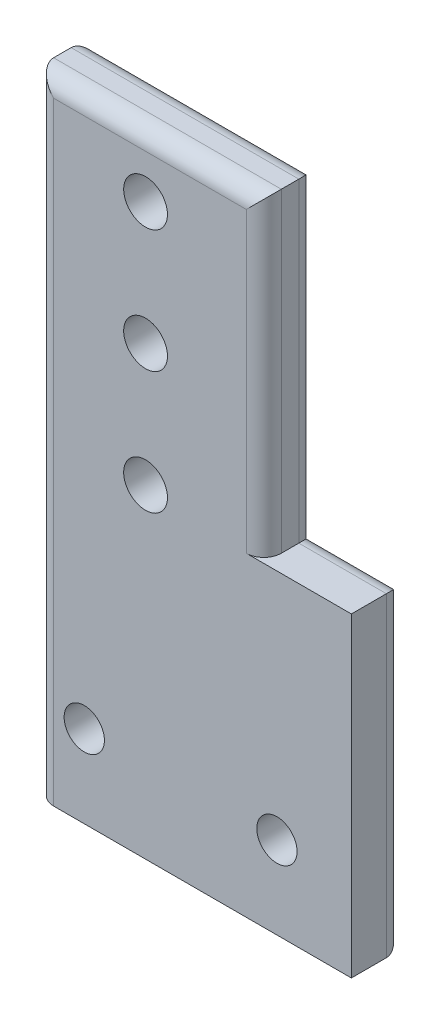
ISO-10303-21;
HEADER;
FILE_DESCRIPTION(('STEP AP214'),'2;1');
FILE_NAME('part.step','',(''),(''),'','','');
FILE_SCHEMA(('AUTOMOTIVE_DESIGN { 1 0 10303 214 1 1 1 1 }'));
ENDSEC;
DATA;
#1=APPLICATION_CONTEXT('core data for automotive mechanical design processes');
#2=APPLICATION_PROTOCOL_DEFINITION('international standard','automotive_design',2000,#1);
#3=PRODUCT_CONTEXT('',#1,'mechanical');
#4=PRODUCT('Part','Part','',(#3));
#5=PRODUCT_RELATED_PRODUCT_CATEGORY('part','',(#4));
#6=PRODUCT_DEFINITION_FORMATION('','',#4);
#7=PRODUCT_DEFINITION_CONTEXT('part definition',#1,'design');
#8=PRODUCT_DEFINITION('design','',#6,#7);
#9=PRODUCT_DEFINITION_SHAPE('','',#8);
#10=(LENGTH_UNIT() NAMED_UNIT(*) SI_UNIT(.MILLI.,.METRE.));
#11=(NAMED_UNIT(*) PLANE_ANGLE_UNIT() SI_UNIT($,.RADIAN.));
#12=(NAMED_UNIT(*) SI_UNIT($,.STERADIAN.) SOLID_ANGLE_UNIT());
#13=UNCERTAINTY_MEASURE_WITH_UNIT(LENGTH_MEASURE(1.E-05),#10,'distance_accuracy_value','');
#14=(GEOMETRIC_REPRESENTATION_CONTEXT(3) GLOBAL_UNCERTAINTY_ASSIGNED_CONTEXT((#13)) GLOBAL_UNIT_ASSIGNED_CONTEXT((#10,
#11,#12)) REPRESENTATION_CONTEXT('',''));
#15=CARTESIAN_POINT('',(0.,0.,0.));
#16=DIRECTION('',(0.,0.,1.));
#17=DIRECTION('',(1.,0.,0.));
#18=AXIS2_PLACEMENT_3D('',#15,#16,#17);
#19=CARTESIAN_POINT('',(0.,0.,3.));
#20=DIRECTION('',(0.,0.,-1.));
#21=DIRECTION('',(-1.,0.,0.));
#22=AXIS2_PLACEMENT_3D('',#19,#20,#21);
#23=PLANE('',#22);
#24=DIRECTION('',(-1.,0.,0.));
#25=VECTOR('',#24,1.);
#26=CARTESIAN_POINT('',(-14.25,3.00000000000001,3.));
#27=LINE('',#26,#25);
#28=CARTESIAN_POINT('',(-9.24999999999998,3.00000000000001,3.));
#29=VERTEX_POINT('',#28);
#30=CARTESIAN_POINT('',(-15.25,3.00000000000001,3.));
#31=VERTEX_POINT('',#30);
#32=EDGE_CURVE('E63',#29,#31,#27,.T.);
#33=ORIENTED_EDGE('',*,*,#32,.T.);
#34=DIRECTION('',(0.,1.,0.));
#35=VECTOR('',#34,1.);
#36=CARTESIAN_POINT('',(-15.25,0.,3.));
#37=LINE('',#36,#35);
#38=CARTESIAN_POINT('',(-15.25,20.,3.));
#39=VERTEX_POINT('',#38);
#40=EDGE_CURVE('E55',#31,#39,#37,.T.);
#41=ORIENTED_EDGE('',*,*,#40,.T.);
#42=DIRECTION('',(-1.,0.,0.));
#43=VECTOR('',#42,1.);
#44=CARTESIAN_POINT('',(0.,20.,3.));
#45=LINE('',#44,#43);
#46=CARTESIAN_POINT('',(-26.25,20.,3.));
#47=VERTEX_POINT('',#46);
#48=EDGE_CURVE('E226',#39,#47,#45,.T.);
#49=ORIENTED_EDGE('',*,*,#48,.T.);
#50=DIRECTION('',(0.,-1.,0.));
#51=VECTOR('',#50,1.);
#52=CARTESIAN_POINT('',(-26.25,0.,3.));
#53=LINE('',#52,#51);
#54=CARTESIAN_POINT('',(-26.25,-15.,3.));
#55=VERTEX_POINT('',#54);
#56=EDGE_CURVE('E134',#47,#55,#53,.T.);
#57=ORIENTED_EDGE('',*,*,#56,.T.);
#58=DIRECTION('',(1.,0.,0.));
#59=VECTOR('',#58,1.);
#60=CARTESIAN_POINT('',(-9.24999999999998,-15.,3.));
#61=LINE('',#60,#59);
#62=CARTESIAN_POINT('',(-9.24999999999998,-15.,3.));
#63=VERTEX_POINT('',#62);
#64=EDGE_CURVE('E127',#55,#63,#61,.T.);
#65=ORIENTED_EDGE('',*,*,#64,.T.);
#66=DIRECTION('',(0.,1.,0.));
#67=VECTOR('',#66,1.);
#68=CARTESIAN_POINT('',(-9.24999999999998,3.00000000000001,3.));
#69=LINE('',#68,#67);
#70=EDGE_CURVE('E131',#63,#29,#69,.T.);
#71=ORIENTED_EDGE('',*,*,#70,.T.);
#72=EDGE_LOOP('',(#33,#41,#49,#57,#65,#71));
#73=FACE_BOUND('',#72,.T.);
#74=CARTESIAN_POINT('',(-21.,17.5,3.));
#75=DIRECTION('',(0.,0.,1.));
#76=DIRECTION('',(1.,0.,0.));
#77=AXIS2_PLACEMENT_3D('',#74,#75,#76);
#78=CIRCLE('',#77,1.25);
#79=CARTESIAN_POINT('',(-19.75,17.5,3.));
#80=VERTEX_POINT('',#79);
#81=EDGE_CURVE('E138',#80,#80,#78,.T.);
#82=ORIENTED_EDGE('',*,*,#81,.F.);
#83=EDGE_LOOP('',(#82));
#84=FACE_BOUND('',#83,.T.);
#85=CARTESIAN_POINT('',(-21.,10.5,3.));
#86=DIRECTION('',(0.,0.,1.));
#87=DIRECTION('',(1.,0.,0.));
#88=AXIS2_PLACEMENT_3D('',#85,#86,#87);
#89=CIRCLE('',#88,1.25);
#90=CARTESIAN_POINT('',(-19.75,10.5,3.));
#91=VERTEX_POINT('',#90);
#92=EDGE_CURVE('E379',#91,#91,#89,.T.);
#93=ORIENTED_EDGE('',*,*,#92,.F.);
#94=EDGE_LOOP('',(#93));
#95=FACE_BOUND('',#94,.T.);
#96=CARTESIAN_POINT('',(-21.,3.5,3.));
#97=DIRECTION('',(0.,0.,1.));
#98=DIRECTION('',(1.,0.,0.));
#99=AXIS2_PLACEMENT_3D('',#96,#97,#98);
#100=CIRCLE('',#99,1.25);
#101=CARTESIAN_POINT('',(-19.75,3.5,3.));
#102=VERTEX_POINT('',#101);
#103=EDGE_CURVE('E385',#102,#102,#100,.T.);
#104=ORIENTED_EDGE('',*,*,#103,.F.);
#105=EDGE_LOOP('',(#104));
#106=FACE_BOUND('',#105,.T.);
#107=CARTESIAN_POINT('',(-13.5,-10.3000000000001,3.));
#108=DIRECTION('',(0.,0.,1.));
#109=DIRECTION('',(1.,0.,0.));
#110=AXIS2_PLACEMENT_3D('',#107,#108,#109);
#111=CIRCLE('',#110,1.15);
#112=CARTESIAN_POINT('',(-12.35,-10.3000000000001,3.));
#113=VERTEX_POINT('',#112);
#114=EDGE_CURVE('E416',#113,#113,#111,.T.);
#115=ORIENTED_EDGE('',*,*,#114,.F.);
#116=EDGE_LOOP('',(#115));
#117=FACE_BOUND('',#116,.T.);
#118=CARTESIAN_POINT('',(-24.5,-10.3000000000001,3.));
#119=DIRECTION('',(0.,0.,1.));
#120=DIRECTION('',(1.,0.,0.));
#121=AXIS2_PLACEMENT_3D('',#118,#119,#120);
#122=CIRCLE('',#121,1.15);
#123=CARTESIAN_POINT('',(-23.35,-10.3000000000001,3.));
#124=VERTEX_POINT('',#123);
#125=EDGE_CURVE('E410',#124,#124,#122,.T.);
#126=ORIENTED_EDGE('',*,*,#125,.F.);
#127=EDGE_LOOP('',(#126));
#128=FACE_BOUND('',#127,.T.);
#129=ADVANCED_FACE('F45',(#73,#84,#95,#106,#117,#128),#23,.F.);
#130=CARTESIAN_POINT('',(0.,0.,0.));
#131=DIRECTION('',(0.,0.,-1.));
#132=DIRECTION('',(-1.,0.,0.));
#133=AXIS2_PLACEMENT_3D('',#130,#131,#132);
#134=PLANE('',#133);
#135=DIRECTION('',(0.,1.,0.));
#136=VECTOR('',#135,1.);
#137=CARTESIAN_POINT('',(-10.25,-15.,0.));
#138=LINE('',#137,#136);
#139=CARTESIAN_POINT('',(-10.25,2.00000000000001,0.));
#140=VERTEX_POINT('',#139);
#141=CARTESIAN_POINT('',(-10.25,-14.,0.));
#142=VERTEX_POINT('',#141);
#143=EDGE_CURVE('E193',#140,#142,#138,.F.);
#144=ORIENTED_EDGE('',*,*,#143,.T.);
#145=DIRECTION('',(1.,0.,0.));
#146=VECTOR('',#145,1.);
#147=CARTESIAN_POINT('',(-27.25,-14.,0.));
#148=LINE('',#147,#146);
#149=CARTESIAN_POINT('',(-26.25,-14.,0.));
#150=VERTEX_POINT('',#149);
#151=EDGE_CURVE('E196',#142,#150,#148,.F.);
#152=ORIENTED_EDGE('',*,*,#151,.T.);
#153=DIRECTION('',(0.,-1.,0.));
#154=VECTOR('',#153,1.);
#155=CARTESIAN_POINT('',(-26.25,21.,0.));
#156=LINE('',#155,#154);
#157=CARTESIAN_POINT('',(-26.25,20.,0.));
#158=VERTEX_POINT('',#157);
#159=EDGE_CURVE('E181',#150,#158,#156,.F.);
#160=ORIENTED_EDGE('',*,*,#159,.T.);
#161=DIRECTION('',(-1.,0.,0.));
#162=VECTOR('',#161,1.);
#163=CARTESIAN_POINT('',(-14.25,20.,0.));
#164=LINE('',#163,#162);
#165=CARTESIAN_POINT('',(-15.25,20.,0.));
#166=VERTEX_POINT('',#165);
#167=EDGE_CURVE('E184',#158,#166,#164,.F.);
#168=ORIENTED_EDGE('',*,*,#167,.T.);
#169=DIRECTION('',(0.,1.,0.));
#170=VECTOR('',#169,1.);
#171=CARTESIAN_POINT('',(-15.25,3.00000000000001,0.));
#172=LINE('',#171,#170);
#173=CARTESIAN_POINT('',(-15.25,2.00000000000001,0.));
#174=VERTEX_POINT('',#173);
#175=EDGE_CURVE('E187',#166,#174,#172,.F.);
#176=ORIENTED_EDGE('',*,*,#175,.T.);
#177=DIRECTION('',(-1.,0.,0.));
#178=VECTOR('',#177,1.);
#179=CARTESIAN_POINT('',(-9.24999999999998,2.00000000000001,0.));
#180=LINE('',#179,#178);
#181=EDGE_CURVE('E190',#174,#140,#180,.F.);
#182=ORIENTED_EDGE('',*,*,#181,.T.);
#183=EDGE_LOOP('',(#144,#152,#160,#168,#176,#182));
#184=FACE_BOUND('',#183,.T.);
#185=CARTESIAN_POINT('',(-13.5,-10.3000000000001,0.));
#186=DIRECTION('',(0.,0.,1.));
#187=DIRECTION('',(1.,0.,0.));
#188=AXIS2_PLACEMENT_3D('',#185,#186,#187);
#189=CIRCLE('',#188,1.15);
#190=CARTESIAN_POINT('',(-12.35,-10.3000000000001,0.));
#191=VERTEX_POINT('',#190);
#192=EDGE_CURVE('E413',#191,#191,#189,.T.);
#193=ORIENTED_EDGE('',*,*,#192,.T.);
#194=EDGE_LOOP('',(#193));
#195=FACE_BOUND('',#194,.T.);
#196=CARTESIAN_POINT('',(-21.,10.5,0.));
#197=DIRECTION('',(0.,0.,1.));
#198=DIRECTION('',(1.,0.,0.));
#199=AXIS2_PLACEMENT_3D('',#196,#197,#198);
#200=CIRCLE('',#199,1.25);
#201=CARTESIAN_POINT('',(-19.75,10.5,0.));
#202=VERTEX_POINT('',#201);
#203=EDGE_CURVE('E382',#202,#202,#200,.T.);
#204=ORIENTED_EDGE('',*,*,#203,.T.);
#205=EDGE_LOOP('',(#204));
#206=FACE_BOUND('',#205,.T.);
#207=CARTESIAN_POINT('',(-21.,17.5,0.));
#208=DIRECTION('',(0.,0.,1.));
#209=DIRECTION('',(1.,0.,0.));
#210=AXIS2_PLACEMENT_3D('',#207,#208,#209);
#211=CIRCLE('',#210,1.25);
#212=CARTESIAN_POINT('',(-19.75,17.5,0.));
#213=VERTEX_POINT('',#212);
#214=EDGE_CURVE('E389',#213,#213,#211,.T.);
#215=ORIENTED_EDGE('',*,*,#214,.T.);
#216=EDGE_LOOP('',(#215));
#217=FACE_BOUND('',#216,.T.);
#218=CARTESIAN_POINT('',(-21.,3.5,0.));
#219=DIRECTION('',(0.,0.,1.));
#220=DIRECTION('',(1.,0.,0.));
#221=AXIS2_PLACEMENT_3D('',#218,#219,#220);
#222=CIRCLE('',#221,1.25);
#223=CARTESIAN_POINT('',(-19.75,3.5,0.));
#224=VERTEX_POINT('',#223);
#225=EDGE_CURVE('E392',#224,#224,#222,.T.);
#226=ORIENTED_EDGE('',*,*,#225,.T.);
#227=EDGE_LOOP('',(#226));
#228=FACE_BOUND('',#227,.T.);
#229=CARTESIAN_POINT('',(-24.5,-10.3000000000001,0.));
#230=DIRECTION('',(0.,0.,1.));
#231=DIRECTION('',(1.,0.,0.));
#232=AXIS2_PLACEMENT_3D('',#229,#230,#231);
#233=CIRCLE('',#232,1.15);
#234=CARTESIAN_POINT('',(-23.35,-10.3000000000001,0.));
#235=VERTEX_POINT('',#234);
#236=EDGE_CURVE('E252',#235,#235,#233,.T.);
#237=ORIENTED_EDGE('',*,*,#236,.T.);
#238=EDGE_LOOP('',(#237));
#239=FACE_BOUND('',#238,.T.);
#240=ADVANCED_FACE('F285',(#184,#195,#206,#217,#228,#239),#134,.T.);
#241=CARTESIAN_POINT('',(-27.25,21.,3.));
#242=DIRECTION('',(0.,-1.,0.));
#243=DIRECTION('',(0.,0.,-1.));
#244=AXIS2_PLACEMENT_3D('',#241,#242,#243);
#245=PLANE('',#244);
#246=DIRECTION('',(0.,0.,-1.));
#247=VECTOR('',#246,1.);
#248=CARTESIAN_POINT('',(-14.25,21.,3.));
#249=LINE('',#248,#247);
#250=CARTESIAN_POINT('',(-14.25,21.,2.));
#251=VERTEX_POINT('',#250);
#252=CARTESIAN_POINT('',(-14.25,21.,1.));
#253=VERTEX_POINT('',#252);
#254=EDGE_CURVE('E157',#251,#253,#249,.T.);
#255=ORIENTED_EDGE('',*,*,#254,.T.);
#256=DIRECTION('',(-1.,0.,0.));
#257=VECTOR('',#256,1.);
#258=CARTESIAN_POINT('',(-27.25,21.,1.));
#259=LINE('',#258,#257);
#260=CARTESIAN_POINT('',(-27.25,21.,1.));
#261=VERTEX_POINT('',#260);
#262=EDGE_CURVE('E215',#253,#261,#259,.T.);
#263=ORIENTED_EDGE('',*,*,#262,.T.);
#264=DIRECTION('',(0.,0.,-1.));
#265=VECTOR('',#264,1.);
#266=CARTESIAN_POINT('',(-27.25,21.,3.));
#267=LINE('',#266,#265);
#268=CARTESIAN_POINT('',(-27.25,21.,2.));
#269=VERTEX_POINT('',#268);
#270=EDGE_CURVE('E172',#269,#261,#267,.T.);
#271=ORIENTED_EDGE('',*,*,#270,.F.);
#272=DIRECTION('',(-1.,0.,0.));
#273=VECTOR('',#272,1.);
#274=CARTESIAN_POINT('',(-27.25,21.,2.));
#275=LINE('',#274,#273);
#276=EDGE_CURVE('E212',#269,#251,#275,.F.);
#277=ORIENTED_EDGE('',*,*,#276,.T.);
#278=EDGE_LOOP('',(#255,#263,#271,#277));
#279=FACE_BOUND('',#278,.T.);
#280=ADVANCED_FACE('F304',(#279),#245,.F.);
#281=CARTESIAN_POINT('',(-27.25,-15.,3.));
#282=DIRECTION('',(1.,0.,0.));
#283=DIRECTION('',(0.,1.,0.));
#284=AXIS2_PLACEMENT_3D('',#281,#282,#283);
#285=PLANE('',#284);
#286=ORIENTED_EDGE('',*,*,#270,.T.);
#287=DIRECTION('',(0.,-1.,0.));
#288=VECTOR('',#287,1.);
#289=CARTESIAN_POINT('',(-27.25,-15.,1.));
#290=LINE('',#289,#288);
#291=CARTESIAN_POINT('',(-27.25,-15.,1.));
#292=VERTEX_POINT('',#291);
#293=EDGE_CURVE('E221',#261,#292,#290,.T.);
#294=ORIENTED_EDGE('',*,*,#293,.T.);
#295=DIRECTION('',(0.,0.,-1.));
#296=VECTOR('',#295,1.);
#297=CARTESIAN_POINT('',(-27.25,-15.,3.));
#298=LINE('',#297,#296);
#299=CARTESIAN_POINT('',(-27.25,-15.,2.));
#300=VERTEX_POINT('',#299);
#301=EDGE_CURVE('E149',#300,#292,#298,.T.);
#302=ORIENTED_EDGE('',*,*,#301,.F.);
#303=DIRECTION('',(0.,-1.,0.));
#304=VECTOR('',#303,1.);
#305=CARTESIAN_POINT('',(-27.25,-15.,2.));
#306=LINE('',#305,#304);
#307=EDGE_CURVE('E218',#300,#269,#306,.F.);
#308=ORIENTED_EDGE('',*,*,#307,.T.);
#309=EDGE_LOOP('',(#286,#294,#302,#308));
#310=FACE_BOUND('',#309,.T.);
#311=ADVANCED_FACE('F307',(#310),#285,.F.);
#312=CARTESIAN_POINT('',(-9.24999999999998,-15.,3.));
#313=DIRECTION('',(0.,1.,0.));
#314=DIRECTION('',(-1.,0.,0.));
#315=AXIS2_PLACEMENT_3D('',#312,#313,#314);
#316=PLANE('',#315);
#317=ORIENTED_EDGE('',*,*,#301,.T.);
#318=DIRECTION('',(1.,0.,0.));
#319=VECTOR('',#318,1.);
#320=CARTESIAN_POINT('',(-9.24999999999998,-15.,1.));
#321=LINE('',#320,#319);
#322=CARTESIAN_POINT('',(-9.24999999999998,-15.,1.));
#323=VERTEX_POINT('',#322);
#324=EDGE_CURVE('E146',#292,#323,#321,.T.);
#325=ORIENTED_EDGE('',*,*,#324,.T.);
#326=DIRECTION('',(0.,0.,-1.));
#327=VECTOR('',#326,1.);
#328=CARTESIAN_POINT('',(-9.24999999999998,-15.,3.));
#329=LINE('',#328,#327);
#330=EDGE_CURVE('E142',#63,#323,#329,.T.);
#331=ORIENTED_EDGE('',*,*,#330,.F.);
#332=ORIENTED_EDGE('',*,*,#64,.F.);
#333=CARTESIAN_POINT('',(-26.25,-15.,2.));
#334=DIRECTION('',(0.,1.,0.));
#335=DIRECTION('',(-1.,0.,0.));
#336=AXIS2_PLACEMENT_3D('',#333,#334,#335);
#337=CIRCLE('',#336,1.);
#338=EDGE_CURVE('E176',#55,#300,#337,.F.);
#339=ORIENTED_EDGE('',*,*,#338,.T.);
#340=EDGE_LOOP('',(#317,#325,#331,#332,#339));
#341=FACE_BOUND('',#340,.T.);
#342=ADVANCED_FACE('F144',(#341),#316,.F.);
#343=CARTESIAN_POINT('',(-9.24999999999998,3.00000000000001,3.));
#344=DIRECTION('',(-1.,0.,0.));
#345=DIRECTION('',(0.,-1.,0.));
#346=AXIS2_PLACEMENT_3D('',#343,#344,#345);
#347=PLANE('',#346);
#348=ORIENTED_EDGE('',*,*,#330,.T.);
#349=DIRECTION('',(0.,1.,0.));
#350=VECTOR('',#349,1.);
#351=CARTESIAN_POINT('',(-9.24999999999998,3.00000000000001,1.));
#352=LINE('',#351,#350);
#353=CARTESIAN_POINT('',(-9.24999999999998,3.00000000000001,1.));
#354=VERTEX_POINT('',#353);
#355=EDGE_CURVE('E200',#323,#354,#352,.T.);
#356=ORIENTED_EDGE('',*,*,#355,.T.);
#357=DIRECTION('',(0.,0.,-1.));
#358=VECTOR('',#357,1.);
#359=CARTESIAN_POINT('',(-9.24999999999998,3.00000000000001,3.));
#360=LINE('',#359,#358);
#361=EDGE_CURVE('E150',#29,#354,#360,.T.);
#362=ORIENTED_EDGE('',*,*,#361,.F.);
#363=ORIENTED_EDGE('',*,*,#70,.F.);
#364=EDGE_LOOP('',(#348,#356,#362,#363));
#365=FACE_BOUND('',#364,.T.);
#366=ADVANCED_FACE('F152',(#365),#347,.F.);
#367=CARTESIAN_POINT('',(-14.25,3.00000000000001,3.));
#368=DIRECTION('',(0.,-1.,0.));
#369=DIRECTION('',(0.,0.,-1.));
#370=AXIS2_PLACEMENT_3D('',#367,#368,#369);
#371=PLANE('',#370);
#372=ORIENTED_EDGE('',*,*,#361,.T.);
#373=DIRECTION('',(-1.,0.,0.));
#374=VECTOR('',#373,1.);
#375=CARTESIAN_POINT('',(-14.25,3.00000000000001,1.));
#376=LINE('',#375,#374);
#377=CARTESIAN_POINT('',(-14.25,3.00000000000001,1.));
#378=VERTEX_POINT('',#377);
#379=EDGE_CURVE('E203',#354,#378,#376,.T.);
#380=ORIENTED_EDGE('',*,*,#379,.T.);
#381=DIRECTION('',(0.,0.,-1.));
#382=VECTOR('',#381,1.);
#383=CARTESIAN_POINT('',(-14.25,3.00000000000001,3.));
#384=LINE('',#383,#382);
#385=CARTESIAN_POINT('',(-14.25,3.00000000000001,2.));
#386=VERTEX_POINT('',#385);
#387=EDGE_CURVE('E164',#386,#378,#384,.T.);
#388=ORIENTED_EDGE('',*,*,#387,.F.);
#389=CARTESIAN_POINT('',(-15.25,3.00000000000001,2.));
#390=DIRECTION('',(0.,-1.,0.));
#391=DIRECTION('',(0.,0.,-1.));
#392=AXIS2_PLACEMENT_3D('',#389,#390,#391);
#393=CIRCLE('',#392,1.);
#394=EDGE_CURVE('E11',#386,#31,#393,.T.);
#395=ORIENTED_EDGE('',*,*,#394,.T.);
#396=ORIENTED_EDGE('',*,*,#32,.F.);
#397=EDGE_LOOP('',(#372,#380,#388,#395,#396));
#398=FACE_BOUND('',#397,.T.);
#399=ADVANCED_FACE('F271',(#398),#371,.F.);
#400=CARTESIAN_POINT('',(-14.25,21.,3.));
#401=DIRECTION('',(-1.,0.,0.));
#402=DIRECTION('',(0.,-1.,0.));
#403=AXIS2_PLACEMENT_3D('',#400,#401,#402);
#404=PLANE('',#403);
#405=ORIENTED_EDGE('',*,*,#387,.T.);
#406=DIRECTION('',(0.,1.,0.));
#407=VECTOR('',#406,1.);
#408=CARTESIAN_POINT('',(-14.25,21.,1.));
#409=LINE('',#408,#407);
#410=EDGE_CURVE('E209',#378,#253,#409,.T.);
#411=ORIENTED_EDGE('',*,*,#410,.T.);
#412=ORIENTED_EDGE('',*,*,#254,.F.);
#413=DIRECTION('',(0.,1.,0.));
#414=VECTOR('',#413,1.);
#415=CARTESIAN_POINT('',(-14.25,21.,2.));
#416=LINE('',#415,#414);
#417=EDGE_CURVE('E206',#251,#386,#416,.F.);
#418=ORIENTED_EDGE('',*,*,#417,.T.);
#419=EDGE_LOOP('',(#405,#411,#412,#418));
#420=FACE_BOUND('',#419,.T.);
#421=ADVANCED_FACE('F268',(#420),#404,.F.);
#422=CARTESIAN_POINT('',(-21.,17.5,3.));
#423=DIRECTION('',(0.,0.,-1.));
#424=DIRECTION('',(-1.,0.,0.));
#425=AXIS2_PLACEMENT_3D('',#422,#423,#424);
#426=CYLINDRICAL_SURFACE('',#425,1.25);
#427=ORIENTED_EDGE('',*,*,#81,.T.);
#428=EDGE_LOOP('',(#427));
#429=FACE_BOUND('',#428,.T.);
#430=ORIENTED_EDGE('',*,*,#214,.F.);
#431=EDGE_LOOP('',(#430));
#432=FACE_BOUND('',#431,.T.);
#433=ADVANCED_FACE('F326',(#429,#432),#426,.F.);
#434=CARTESIAN_POINT('',(-21.,10.5,3.));
#435=DIRECTION('',(0.,0.,-1.));
#436=DIRECTION('',(-1.,0.,0.));
#437=AXIS2_PLACEMENT_3D('',#434,#435,#436);
#438=CYLINDRICAL_SURFACE('',#437,1.25);
#439=ORIENTED_EDGE('',*,*,#92,.T.);
#440=EDGE_LOOP('',(#439));
#441=FACE_BOUND('',#440,.T.);
#442=ORIENTED_EDGE('',*,*,#203,.F.);
#443=EDGE_LOOP('',(#442));
#444=FACE_BOUND('',#443,.T.);
#445=ADVANCED_FACE('F368',(#441,#444),#438,.F.);
#446=CARTESIAN_POINT('',(-21.,3.5,3.));
#447=DIRECTION('',(0.,0.,-1.));
#448=DIRECTION('',(-1.,0.,0.));
#449=AXIS2_PLACEMENT_3D('',#446,#447,#448);
#450=CYLINDRICAL_SURFACE('',#449,1.25);
#451=ORIENTED_EDGE('',*,*,#103,.T.);
#452=EDGE_LOOP('',(#451));
#453=FACE_BOUND('',#452,.T.);
#454=ORIENTED_EDGE('',*,*,#225,.F.);
#455=EDGE_LOOP('',(#454));
#456=FACE_BOUND('',#455,.T.);
#457=ADVANCED_FACE('F361',(#453,#456),#450,.F.);
#458=CARTESIAN_POINT('',(-13.5,-10.3000000000001,3.));
#459=DIRECTION('',(0.,0.,-1.));
#460=DIRECTION('',(-1.,0.,0.));
#461=AXIS2_PLACEMENT_3D('',#458,#459,#460);
#462=CYLINDRICAL_SURFACE('',#461,1.15);
#463=ORIENTED_EDGE('',*,*,#114,.T.);
#464=EDGE_LOOP('',(#463));
#465=FACE_BOUND('',#464,.T.);
#466=ORIENTED_EDGE('',*,*,#192,.F.);
#467=EDGE_LOOP('',(#466));
#468=FACE_BOUND('',#467,.T.);
#469=ADVANCED_FACE('F355',(#465,#468),#462,.F.);
#470=CARTESIAN_POINT('',(-24.5,-10.3000000000001,3.));
#471=DIRECTION('',(0.,0.,-1.));
#472=DIRECTION('',(-1.,0.,0.));
#473=AXIS2_PLACEMENT_3D('',#470,#471,#472);
#474=CYLINDRICAL_SURFACE('',#473,1.15);
#475=ORIENTED_EDGE('',*,*,#125,.T.);
#476=EDGE_LOOP('',(#475));
#477=FACE_BOUND('',#476,.T.);
#478=ORIENTED_EDGE('',*,*,#236,.F.);
#479=EDGE_LOOP('',(#478));
#480=FACE_BOUND('',#479,.T.);
#481=ADVANCED_FACE('F352',(#477,#480),#474,.F.);
#482=CARTESIAN_POINT('',(-15.25,21.,1.));
#483=DIRECTION('',(0.,-1.,0.));
#484=DIRECTION('',(1.,0.,0.));
#485=AXIS2_PLACEMENT_3D('',#482,#483,#484);
#486=CYLINDRICAL_SURFACE('',#485,1.);
#487=CARTESIAN_POINT('',(-15.25,2.00000000000001,1.));
#488=DIRECTION('',(0.707106781186547,-0.707106781186548,0.));
#489=DIRECTION('',(0.707106781186548,0.707106781186547,0.));
#490=AXIS2_PLACEMENT_3D('',#487,#488,#489);
#491=ELLIPSE('',#490,1.4142135623731,1.);
#492=EDGE_CURVE('E245',#174,#378,#491,.T.);
#493=ORIENTED_EDGE('',*,*,#492,.F.);
#494=ORIENTED_EDGE('',*,*,#175,.F.);
#495=CARTESIAN_POINT('',(-15.25,20.,1.));
#496=DIRECTION('',(0.707106781186547,-0.707106781186548,0.));
#497=DIRECTION('',(0.707106781186548,0.707106781186547,0.));
#498=AXIS2_PLACEMENT_3D('',#495,#496,#497);
#499=ELLIPSE('',#498,1.4142135623731,1.);
#500=EDGE_CURVE('E249',#253,#166,#499,.F.);
#501=ORIENTED_EDGE('',*,*,#500,.F.);
#502=ORIENTED_EDGE('',*,*,#410,.F.);
#503=EDGE_LOOP('',(#493,#494,#501,#502));
#504=FACE_BOUND('',#503,.T.);
#505=ADVANCED_FACE('F302',(#504),#486,.T.);
#506=CARTESIAN_POINT('',(-27.25,20.,1.));
#507=DIRECTION('',(1.,0.,0.));
#508=DIRECTION('',(0.,0.,-1.));
#509=AXIS2_PLACEMENT_3D('',#506,#507,#508);
#510=CYLINDRICAL_SURFACE('',#509,1.);
#511=ORIENTED_EDGE('',*,*,#500,.T.);
#512=ORIENTED_EDGE('',*,*,#167,.F.);
#513=CARTESIAN_POINT('',(-26.25,20.,1.));
#514=DIRECTION('',(0.707106781186547,0.707106781186548,0.));
#515=DIRECTION('',(-0.707106781186548,0.707106781186547,0.));
#516=AXIS2_PLACEMENT_3D('',#513,#514,#515);
#517=ELLIPSE('',#516,1.4142135623731,1.);
#518=EDGE_CURVE('E241',#261,#158,#517,.F.);
#519=ORIENTED_EDGE('',*,*,#518,.F.);
#520=ORIENTED_EDGE('',*,*,#262,.F.);
#521=EDGE_LOOP('',(#511,#512,#519,#520));
#522=FACE_BOUND('',#521,.T.);
#523=ADVANCED_FACE('F298',(#522),#510,.T.);
#524=CARTESIAN_POINT('',(-14.25,2.00000000000001,1.));
#525=DIRECTION('',(1.,0.,0.));
#526=DIRECTION('',(0.,0.,-1.));
#527=AXIS2_PLACEMENT_3D('',#524,#525,#526);
#528=CYLINDRICAL_SURFACE('',#527,1.);
#529=ORIENTED_EDGE('',*,*,#492,.T.);
#530=ORIENTED_EDGE('',*,*,#379,.F.);
#531=CARTESIAN_POINT('',(-10.25,2.00000000000001,1.));
#532=DIRECTION('',(0.707106781186548,-0.707106781186547,0.));
#533=DIRECTION('',(0.707106781186547,0.707106781186548,0.));
#534=AXIS2_PLACEMENT_3D('',#531,#532,#533);
#535=ELLIPSE('',#534,1.41421356237309,1.);
#536=EDGE_CURVE('E237',#140,#354,#535,.T.);
#537=ORIENTED_EDGE('',*,*,#536,.F.);
#538=ORIENTED_EDGE('',*,*,#181,.F.);
#539=EDGE_LOOP('',(#529,#530,#537,#538));
#540=FACE_BOUND('',#539,.T.);
#541=ADVANCED_FACE('F275',(#540),#528,.T.);
#542=CARTESIAN_POINT('',(-26.25,-15.,1.));
#543=DIRECTION('',(0.,1.,0.));
#544=DIRECTION('',(-1.,0.,0.));
#545=AXIS2_PLACEMENT_3D('',#542,#543,#544);
#546=CYLINDRICAL_SURFACE('',#545,1.);
#547=ORIENTED_EDGE('',*,*,#518,.T.);
#548=ORIENTED_EDGE('',*,*,#159,.F.);
#549=CARTESIAN_POINT('',(-26.25,-14.,1.));
#550=DIRECTION('',(-0.707106781186548,0.707106781186547,0.));
#551=DIRECTION('',(0.707106781186547,0.707106781186548,0.));
#552=AXIS2_PLACEMENT_3D('',#549,#550,#551);
#553=ELLIPSE('',#552,1.4142135623731,1.);
#554=EDGE_CURVE('E234',#292,#150,#553,.F.);
#555=ORIENTED_EDGE('',*,*,#554,.F.);
#556=ORIENTED_EDGE('',*,*,#293,.F.);
#557=EDGE_LOOP('',(#547,#548,#555,#556));
#558=FACE_BOUND('',#557,.T.);
#559=ADVANCED_FACE('F293',(#558),#546,.T.);
#560=CARTESIAN_POINT('',(-10.25,3.00000000000001,1.));
#561=DIRECTION('',(0.,-1.,0.));
#562=DIRECTION('',(1.,0.,0.));
#563=AXIS2_PLACEMENT_3D('',#560,#561,#562);
#564=CYLINDRICAL_SURFACE('',#563,1.);
#565=ORIENTED_EDGE('',*,*,#536,.T.);
#566=ORIENTED_EDGE('',*,*,#355,.F.);
#567=CARTESIAN_POINT('',(-10.25,-14.,1.));
#568=DIRECTION('',(-0.707106781186547,-0.707106781186548,0.));
#569=DIRECTION('',(0.707106781186548,-0.707106781186547,0.));
#570=AXIS2_PLACEMENT_3D('',#567,#568,#569);
#571=ELLIPSE('',#570,1.41421356237309,1.);
#572=EDGE_CURVE('E231',#142,#323,#571,.T.);
#573=ORIENTED_EDGE('',*,*,#572,.F.);
#574=ORIENTED_EDGE('',*,*,#143,.F.);
#575=EDGE_LOOP('',(#565,#566,#573,#574));
#576=FACE_BOUND('',#575,.T.);
#577=ADVANCED_FACE('F281',(#576),#564,.T.);
#578=CARTESIAN_POINT('',(-9.24999999999998,-14.,1.));
#579=DIRECTION('',(-1.,0.,0.));
#580=DIRECTION('',(0.,-1.,0.));
#581=AXIS2_PLACEMENT_3D('',#578,#579,#580);
#582=CYLINDRICAL_SURFACE('',#581,1.);
#583=ORIENTED_EDGE('',*,*,#554,.T.);
#584=ORIENTED_EDGE('',*,*,#151,.F.);
#585=ORIENTED_EDGE('',*,*,#572,.T.);
#586=ORIENTED_EDGE('',*,*,#324,.F.);
#587=EDGE_LOOP('',(#583,#584,#585,#586));
#588=FACE_BOUND('',#587,.T.);
#589=ADVANCED_FACE('F288',(#588),#582,.T.);
#590=CARTESIAN_POINT('',(-15.25,0.,2.));
#591=DIRECTION('',(0.,1.,0.));
#592=DIRECTION('',(-1.,0.,0.));
#593=AXIS2_PLACEMENT_3D('',#590,#591,#592);
#594=CYLINDRICAL_SURFACE('',#593,1.);
#595=ORIENTED_EDGE('',*,*,#394,.F.);
#596=ORIENTED_EDGE('',*,*,#417,.F.);
#597=CARTESIAN_POINT('',(-15.25,20.,2.));
#598=DIRECTION('',(-0.707106781186547,0.707106781186548,0.));
#599=DIRECTION('',(0.707106781186548,0.707106781186547,0.));
#600=AXIS2_PLACEMENT_3D('',#597,#598,#599);
#601=ELLIPSE('',#600,1.4142135623731,1.);
#602=EDGE_CURVE('E49',#39,#251,#601,.T.);
#603=ORIENTED_EDGE('',*,*,#602,.F.);
#604=ORIENTED_EDGE('',*,*,#40,.F.);
#605=EDGE_LOOP('',(#595,#596,#603,#604));
#606=FACE_BOUND('',#605,.T.);
#607=ADVANCED_FACE('F47',(#606),#594,.T.);
#608=CARTESIAN_POINT('',(-26.25,0.,2.));
#609=DIRECTION('',(0.,-1.,0.));
#610=DIRECTION('',(1.,0.,0.));
#611=AXIS2_PLACEMENT_3D('',#608,#609,#610);
#612=CYLINDRICAL_SURFACE('',#611,1.);
#613=ORIENTED_EDGE('',*,*,#338,.F.);
#614=ORIENTED_EDGE('',*,*,#56,.F.);
#615=CARTESIAN_POINT('',(-26.25,20.,2.));
#616=DIRECTION('',(-0.707106781186547,-0.707106781186548,0.));
#617=DIRECTION('',(0.707106781186548,-0.707106781186547,0.));
#618=AXIS2_PLACEMENT_3D('',#615,#616,#617);
#619=ELLIPSE('',#618,1.4142135623731,1.);
#620=EDGE_CURVE('E253',#269,#47,#619,.F.);
#621=ORIENTED_EDGE('',*,*,#620,.F.);
#622=ORIENTED_EDGE('',*,*,#307,.F.);
#623=EDGE_LOOP('',(#613,#614,#621,#622));
#624=FACE_BOUND('',#623,.T.);
#625=ADVANCED_FACE('F311',(#624),#612,.T.);
#626=CARTESIAN_POINT('',(0.,20.,2.));
#627=DIRECTION('',(-1.,0.,0.));
#628=DIRECTION('',(0.,0.,1.));
#629=AXIS2_PLACEMENT_3D('',#626,#627,#628);
#630=CYLINDRICAL_SURFACE('',#629,1.);
#631=ORIENTED_EDGE('',*,*,#602,.T.);
#632=ORIENTED_EDGE('',*,*,#276,.F.);
#633=ORIENTED_EDGE('',*,*,#620,.T.);
#634=ORIENTED_EDGE('',*,*,#48,.F.);
#635=EDGE_LOOP('',(#631,#632,#633,#634));
#636=FACE_BOUND('',#635,.T.);
#637=ADVANCED_FACE('F261',(#636),#630,.T.);
#638=CLOSED_SHELL('',(#129,#240,#280,#311,#342,#366,#399,#421,#433,#445,#457,#469,#481,#505,
#523,#541,#559,#577,#589,#607,#625,#637));
#639=MANIFOLD_SOLID_BREP('B2',#638);
#640=ADVANCED_BREP_SHAPE_REPRESENTATION('',(#18,#639),#14);
#641=SHAPE_DEFINITION_REPRESENTATION(#9,#640);
ENDSEC;
END-ISO-10303-21;
